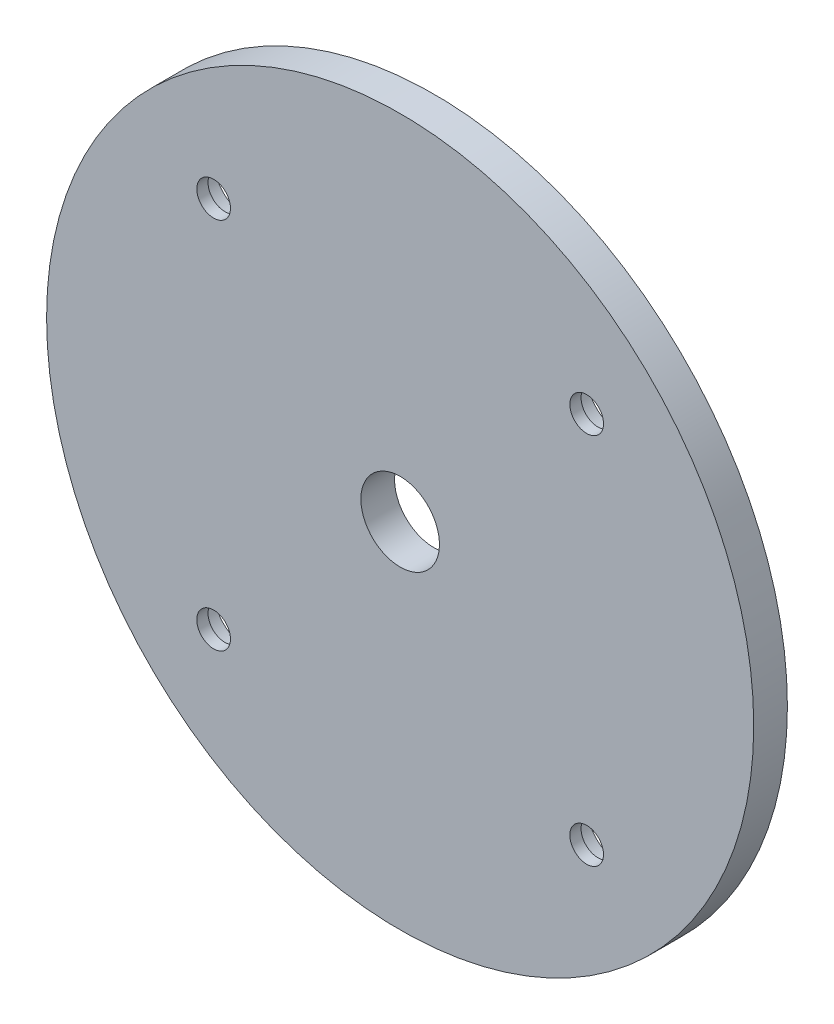
ISO-10303-21;
HEADER;
FILE_DESCRIPTION(('STEP AP214'),'2;1');
FILE_NAME('part.step','',(''),(''),'','','');
FILE_SCHEMA(('AUTOMOTIVE_DESIGN { 1 0 10303 214 1 1 1 1 }'));
ENDSEC;
DATA;
#1=APPLICATION_CONTEXT('core data for automotive mechanical design processes');
#2=APPLICATION_PROTOCOL_DEFINITION('international standard','automotive_design',2000,#1);
#3=PRODUCT_CONTEXT('',#1,'mechanical');
#4=PRODUCT('Part','Part','',(#3));
#5=PRODUCT_RELATED_PRODUCT_CATEGORY('part','',(#4));
#6=PRODUCT_DEFINITION_FORMATION('','',#4);
#7=PRODUCT_DEFINITION_CONTEXT('part definition',#1,'design');
#8=PRODUCT_DEFINITION('design','',#6,#7);
#9=PRODUCT_DEFINITION_SHAPE('','',#8);
#10=(LENGTH_UNIT() NAMED_UNIT(*) SI_UNIT(.MILLI.,.METRE.));
#11=(NAMED_UNIT(*) PLANE_ANGLE_UNIT() SI_UNIT($,.RADIAN.));
#12=(NAMED_UNIT(*) SI_UNIT($,.STERADIAN.) SOLID_ANGLE_UNIT());
#13=UNCERTAINTY_MEASURE_WITH_UNIT(LENGTH_MEASURE(1.E-05),#10,'distance_accuracy_value','');
#14=(GEOMETRIC_REPRESENTATION_CONTEXT(3) GLOBAL_UNCERTAINTY_ASSIGNED_CONTEXT((#13)) GLOBAL_UNIT_ASSIGNED_CONTEXT((#10,
#11,#12)) REPRESENTATION_CONTEXT('',''));
#15=CARTESIAN_POINT('',(0.,0.,0.));
#16=DIRECTION('',(0.,0.,1.));
#17=DIRECTION('',(1.,0.,0.));
#18=AXIS2_PLACEMENT_3D('',#15,#16,#17);
#19=CARTESIAN_POINT('',(-60.0662024055146,24.8241196667046,3.));
#20=DIRECTION('',(0.,0.,-1.));
#21=DIRECTION('',(-1.,0.,0.));
#22=AXIS2_PLACEMENT_3D('',#19,#20,#21);
#23=CYLINDRICAL_SURFACE('',#22,1.5);
#24=CARTESIAN_POINT('',(-60.0662024055146,24.8241196667046,3.));
#25=DIRECTION('',(0.,0.,1.));
#26=DIRECTION('',(1.,0.,0.));
#27=AXIS2_PLACEMENT_3D('',#24,#25,#26);
#28=CIRCLE('',#27,1.5);
#29=CARTESIAN_POINT('',(-58.5662024055146,24.8241196667046,3.));
#30=VERTEX_POINT('',#29);
#31=EDGE_CURVE('E186',#30,#30,#28,.T.);
#32=ORIENTED_EDGE('',*,*,#31,.T.);
#33=EDGE_LOOP('',(#32));
#34=FACE_BOUND('',#33,.T.);
#35=CARTESIAN_POINT('',(-60.0662024055146,24.8241196667046,2.));
#36=DIRECTION('',(0.,0.,-1.));
#37=DIRECTION('',(-1.,0.,0.));
#38=AXIS2_PLACEMENT_3D('',#35,#36,#37);
#39=CIRCLE('',#38,1.5);
#40=CARTESIAN_POINT('',(-61.5662024055146,24.8241196667046,2.));
#41=VERTEX_POINT('',#40);
#42=EDGE_CURVE('E37',#41,#41,#39,.T.);
#43=ORIENTED_EDGE('',*,*,#42,.T.);
#44=EDGE_LOOP('',(#43));
#45=FACE_BOUND('',#44,.T.);
#46=ADVANCED_FACE('F33',(#34,#45),#23,.F.);
#47=CARTESIAN_POINT('',(-26.8321836897469,24.8241196667046,3.));
#48=DIRECTION('',(0.,0.,-1.));
#49=DIRECTION('',(-1.,0.,0.));
#50=AXIS2_PLACEMENT_3D('',#47,#48,#49);
#51=CYLINDRICAL_SURFACE('',#50,1.5);
#52=CARTESIAN_POINT('',(-26.8321836897469,24.8241196667046,3.));
#53=DIRECTION('',(0.,0.,1.));
#54=DIRECTION('',(1.,0.,0.));
#55=AXIS2_PLACEMENT_3D('',#52,#53,#54);
#56=CIRCLE('',#55,1.5);
#57=CARTESIAN_POINT('',(-25.3321836897469,24.8241196667046,3.));
#58=VERTEX_POINT('',#57);
#59=EDGE_CURVE('E183',#58,#58,#56,.T.);
#60=ORIENTED_EDGE('',*,*,#59,.T.);
#61=EDGE_LOOP('',(#60));
#62=FACE_BOUND('',#61,.T.);
#63=CARTESIAN_POINT('',(-26.8321836897469,24.8241196667046,2.));
#64=DIRECTION('',(0.,0.,-1.));
#65=DIRECTION('',(-1.,0.,0.));
#66=AXIS2_PLACEMENT_3D('',#63,#64,#65);
#67=CIRCLE('',#66,1.5);
#68=CARTESIAN_POINT('',(-28.3321836897469,24.8241196667046,2.));
#69=VERTEX_POINT('',#68);
#70=EDGE_CURVE('E197',#69,#69,#67,.T.);
#71=ORIENTED_EDGE('',*,*,#70,.T.);
#72=EDGE_LOOP('',(#71));
#73=FACE_BOUND('',#72,.T.);
#74=ADVANCED_FACE('F266',(#62,#73),#51,.F.);
#75=CARTESIAN_POINT('',(-26.8321836897469,-8.40989904906317,3.));
#76=DIRECTION('',(0.,0.,-1.));
#77=DIRECTION('',(-1.,0.,0.));
#78=AXIS2_PLACEMENT_3D('',#75,#76,#77);
#79=CYLINDRICAL_SURFACE('',#78,1.5);
#80=CARTESIAN_POINT('',(-26.8321836897469,-8.40989904906317,3.));
#81=DIRECTION('',(0.,0.,1.));
#82=DIRECTION('',(1.,0.,0.));
#83=AXIS2_PLACEMENT_3D('',#80,#81,#82);
#84=CIRCLE('',#83,1.5);
#85=CARTESIAN_POINT('',(-25.3321836897469,-8.40989904906317,3.));
#86=VERTEX_POINT('',#85);
#87=EDGE_CURVE('E180',#86,#86,#84,.T.);
#88=ORIENTED_EDGE('',*,*,#87,.T.);
#89=EDGE_LOOP('',(#88));
#90=FACE_BOUND('',#89,.T.);
#91=CARTESIAN_POINT('',(-26.8321836897469,-8.40989904906317,2.));
#92=DIRECTION('',(0.,0.,-1.));
#93=DIRECTION('',(-1.,0.,0.));
#94=AXIS2_PLACEMENT_3D('',#91,#92,#93);
#95=CIRCLE('',#94,1.5);
#96=CARTESIAN_POINT('',(-28.3321836897469,-8.40989904906317,2.));
#97=VERTEX_POINT('',#96);
#98=EDGE_CURVE('E194',#97,#97,#95,.T.);
#99=ORIENTED_EDGE('',*,*,#98,.T.);
#100=EDGE_LOOP('',(#99));
#101=FACE_BOUND('',#100,.T.);
#102=ADVANCED_FACE('F272',(#90,#101),#79,.F.);
#103=CARTESIAN_POINT('',(-60.0662024055146,-8.40989904906316,3.));
#104=DIRECTION('',(0.,0.,-1.));
#105=DIRECTION('',(-1.,0.,0.));
#106=AXIS2_PLACEMENT_3D('',#103,#104,#105);
#107=CYLINDRICAL_SURFACE('',#106,1.5);
#108=CARTESIAN_POINT('',(-60.0662024055146,-8.40989904906316,3.));
#109=DIRECTION('',(0.,0.,1.));
#110=DIRECTION('',(1.,0.,0.));
#111=AXIS2_PLACEMENT_3D('',#108,#109,#110);
#112=CIRCLE('',#111,1.5);
#113=CARTESIAN_POINT('',(-58.5662024055146,-8.40989904906316,3.));
#114=VERTEX_POINT('',#113);
#115=EDGE_CURVE('E175',#114,#114,#112,.T.);
#116=ORIENTED_EDGE('',*,*,#115,.T.);
#117=EDGE_LOOP('',(#116));
#118=FACE_BOUND('',#117,.T.);
#119=CARTESIAN_POINT('',(-60.0662024055146,-8.40989904906316,2.));
#120=DIRECTION('',(0.,0.,-1.));
#121=DIRECTION('',(-1.,0.,0.));
#122=AXIS2_PLACEMENT_3D('',#119,#120,#121);
#123=CIRCLE('',#122,1.5);
#124=CARTESIAN_POINT('',(-61.5662024055146,-8.40989904906316,2.));
#125=VERTEX_POINT('',#124);
#126=EDGE_CURVE('E191',#125,#125,#123,.T.);
#127=ORIENTED_EDGE('',*,*,#126,.T.);
#128=EDGE_LOOP('',(#127));
#129=FACE_BOUND('',#128,.T.);
#130=ADVANCED_FACE('F278',(#118,#129),#107,.F.);
#131=CARTESIAN_POINT('',(-43.4491930476308,8.20711030882074,3.));
#132=DIRECTION('',(0.,0.,1.));
#133=DIRECTION('',(1.,0.,0.));
#134=AXIS2_PLACEMENT_3D('',#131,#132,#133);
#135=PLANE('',#134);
#136=CARTESIAN_POINT('',(-43.4491930476308,8.20711030882074,3.));
#137=DIRECTION('',(0.,0.,-1.));
#138=DIRECTION('',(-1.,0.,0.));
#139=AXIS2_PLACEMENT_3D('',#136,#137,#138);
#140=CIRCLE('',#139,3.5);
#141=CARTESIAN_POINT('',(-46.9491930476308,8.20711030882074,3.));
#142=VERTEX_POINT('',#141);
#143=EDGE_CURVE('E172',#142,#142,#140,.T.);
#144=ORIENTED_EDGE('',*,*,#143,.T.);
#145=EDGE_LOOP('',(#144));
#146=FACE_BOUND('',#145,.T.);
#147=ORIENTED_EDGE('',*,*,#87,.F.);
#148=EDGE_LOOP('',(#147));
#149=FACE_BOUND('',#148,.T.);
#150=ORIENTED_EDGE('',*,*,#31,.F.);
#151=EDGE_LOOP('',(#150));
#152=FACE_BOUND('',#151,.T.);
#153=CARTESIAN_POINT('',(-43.4491930476308,8.20711030882074,3.));
#154=DIRECTION('',(0.,0.,1.));
#155=DIRECTION('',(1.,0.,0.));
#156=AXIS2_PLACEMENT_3D('',#153,#154,#155);
#157=CIRCLE('',#156,31.5);
#158=CARTESIAN_POINT('',(-11.9491930476308,8.20711030882074,3.));
#159=VERTEX_POINT('',#158);
#160=EDGE_CURVE('E11',#159,#159,#157,.T.);
#161=ORIENTED_EDGE('',*,*,#160,.T.);
#162=EDGE_LOOP('',(#161));
#163=FACE_BOUND('',#162,.T.);
#164=ORIENTED_EDGE('',*,*,#59,.F.);
#165=EDGE_LOOP('',(#164));
#166=FACE_BOUND('',#165,.T.);
#167=ORIENTED_EDGE('',*,*,#115,.F.);
#168=EDGE_LOOP('',(#167));
#169=FACE_BOUND('',#168,.T.);
#170=ADVANCED_FACE('F244',(#146,#149,#152,#163,#166,#169),#135,.T.);
#171=CARTESIAN_POINT('',(-43.4491930476308,8.20711030882074,0.));
#172=DIRECTION('',(0.,0.,1.));
#173=DIRECTION('',(1.,0.,0.));
#174=AXIS2_PLACEMENT_3D('',#171,#172,#173);
#175=PLANE('',#174);
#176=CARTESIAN_POINT('',(-60.0662024055146,24.8241196667046,0.));
#177=DIRECTION('',(0.,0.,-1.));
#178=DIRECTION('',(-1.,0.,0.));
#179=AXIS2_PLACEMENT_3D('',#176,#177,#178);
#180=CIRCLE('',#179,3.);
#181=CARTESIAN_POINT('',(-63.0662024055146,24.8241196667046,0.));
#182=VERTEX_POINT('',#181);
#183=EDGE_CURVE('E214',#182,#182,#180,.T.);
#184=ORIENTED_EDGE('',*,*,#183,.F.);
#185=EDGE_LOOP('',(#184));
#186=FACE_BOUND('',#185,.T.);
#187=CARTESIAN_POINT('',(-26.8321836897469,-8.40989904906317,0.));
#188=DIRECTION('',(0.,0.,-1.));
#189=DIRECTION('',(-1.,0.,0.));
#190=AXIS2_PLACEMENT_3D('',#187,#188,#189);
#191=CIRCLE('',#190,3.);
#192=CARTESIAN_POINT('',(-29.8321836897469,-8.40989904906317,0.));
#193=VERTEX_POINT('',#192);
#194=EDGE_CURVE('E226',#193,#193,#191,.T.);
#195=ORIENTED_EDGE('',*,*,#194,.F.);
#196=EDGE_LOOP('',(#195));
#197=FACE_BOUND('',#196,.T.);
#198=CARTESIAN_POINT('',(-60.0662024055146,-8.40989904906316,0.));
#199=DIRECTION('',(0.,0.,-1.));
#200=DIRECTION('',(-1.,0.,0.));
#201=AXIS2_PLACEMENT_3D('',#198,#199,#200);
#202=CIRCLE('',#201,3.00000000000001);
#203=CARTESIAN_POINT('',(-63.0662024055146,-8.40989904906316,0.));
#204=VERTEX_POINT('',#203);
#205=EDGE_CURVE('E221',#204,#204,#202,.T.);
#206=ORIENTED_EDGE('',*,*,#205,.F.);
#207=EDGE_LOOP('',(#206));
#208=FACE_BOUND('',#207,.T.);
#209=CARTESIAN_POINT('',(-26.8321836897469,24.8241196667046,0.));
#210=DIRECTION('',(0.,0.,-1.));
#211=DIRECTION('',(-1.,0.,0.));
#212=AXIS2_PLACEMENT_3D('',#209,#210,#211);
#213=CIRCLE('',#212,3.);
#214=CARTESIAN_POINT('',(-29.8321836897469,24.8241196667046,0.));
#215=VERTEX_POINT('',#214);
#216=EDGE_CURVE('E126',#215,#215,#213,.T.);
#217=ORIENTED_EDGE('',*,*,#216,.F.);
#218=EDGE_LOOP('',(#217));
#219=FACE_BOUND('',#218,.T.);
#220=DIRECTION('',(1.,0.,0.));
#221=VECTOR('',#220,1.);
#222=CARTESIAN_POINT('',(-72.4491930476308,7.20711030882078,0.));
#223=LINE('',#222,#221);
#224=CARTESIAN_POINT('',(-72.4491930476308,7.20711030882078,0.));
#225=VERTEX_POINT('',#224);
#226=CARTESIAN_POINT('',(-69.4491930476308,7.20711030882077,0.));
#227=VERTEX_POINT('',#226);
#228=EDGE_CURVE('E132',#225,#227,#223,.T.);
#229=ORIENTED_EDGE('',*,*,#228,.F.);
#230=CARTESIAN_POINT('',(-43.4491930476308,7.20711030882077,0.));
#231=DIRECTION('',(0.,0.,-1.));
#232=DIRECTION('',(-1.,0.,0.));
#233=AXIS2_PLACEMENT_3D('',#230,#231,#232);
#234=CIRCLE('',#233,29.);
#235=CARTESIAN_POINT('',(-14.4491930476308,7.20711030882077,0.));
#236=VERTEX_POINT('',#235);
#237=EDGE_CURVE('E50',#236,#225,#234,.T.);
#238=ORIENTED_EDGE('',*,*,#237,.F.);
#239=DIRECTION('',(1.,0.,0.));
#240=VECTOR('',#239,1.);
#241=CARTESIAN_POINT('',(-14.4491930476308,7.20711030882077,0.));
#242=LINE('',#241,#240);
#243=CARTESIAN_POINT('',(-17.4491930476308,7.20711030882077,0.));
#244=VERTEX_POINT('',#243);
#245=EDGE_CURVE('E120',#244,#236,#242,.T.);
#246=ORIENTED_EDGE('',*,*,#245,.F.);
#247=CARTESIAN_POINT('',(-43.4491930476308,7.20711030882077,0.));
#248=DIRECTION('',(0.,0.,1.));
#249=DIRECTION('',(-1.,0.,0.));
#250=AXIS2_PLACEMENT_3D('',#247,#248,#249);
#251=CIRCLE('',#250,26.);
#252=EDGE_CURVE('E123',#227,#244,#251,.T.);
#253=ORIENTED_EDGE('',*,*,#252,.F.);
#254=EDGE_LOOP('',(#229,#238,#246,#253));
#255=FACE_BOUND('',#254,.T.);
#256=DIRECTION('',(-1.,0.,0.));
#257=VECTOR('',#256,1.);
#258=CARTESIAN_POINT('',(-14.4491930476308,9.20711030882073,0.));
#259=LINE('',#258,#257);
#260=CARTESIAN_POINT('',(-14.4491930476308,9.20711030882073,0.));
#261=VERTEX_POINT('',#260);
#262=CARTESIAN_POINT('',(-17.4491930476308,9.20711030882072,0.));
#263=VERTEX_POINT('',#262);
#264=EDGE_CURVE('E158',#261,#263,#259,.T.);
#265=ORIENTED_EDGE('',*,*,#264,.F.);
#266=CARTESIAN_POINT('',(-43.4491930476308,9.20711030882073,0.));
#267=DIRECTION('',(0.,0.,-1.));
#268=DIRECTION('',(1.,0.,0.));
#269=AXIS2_PLACEMENT_3D('',#266,#267,#268);
#270=CIRCLE('',#269,29.);
#271=CARTESIAN_POINT('',(-72.4491930476308,9.20711030882073,0.));
#272=VERTEX_POINT('',#271);
#273=EDGE_CURVE('E58',#272,#261,#270,.T.);
#274=ORIENTED_EDGE('',*,*,#273,.F.);
#275=DIRECTION('',(-1.,0.,0.));
#276=VECTOR('',#275,1.);
#277=CARTESIAN_POINT('',(-72.4491930476308,9.20711030882073,0.));
#278=LINE('',#277,#276);
#279=CARTESIAN_POINT('',(-69.4491930476308,9.20711030882072,0.));
#280=VERTEX_POINT('',#279);
#281=EDGE_CURVE('E147',#280,#272,#278,.T.);
#282=ORIENTED_EDGE('',*,*,#281,.F.);
#283=CARTESIAN_POINT('',(-43.4491930476308,9.2071103088207,0.));
#284=DIRECTION('',(0.,0.,1.));
#285=DIRECTION('',(1.,0.,0.));
#286=AXIS2_PLACEMENT_3D('',#283,#284,#285);
#287=CIRCLE('',#286,26.);
#288=EDGE_CURVE('E161',#263,#280,#287,.T.);
#289=ORIENTED_EDGE('',*,*,#288,.F.);
#290=EDGE_LOOP('',(#265,#274,#282,#289));
#291=FACE_BOUND('',#290,.T.);
#292=CARTESIAN_POINT('',(-43.4491930476308,8.20711030882074,0.));
#293=DIRECTION('',(0.,0.,-1.));
#294=DIRECTION('',(-1.,0.,0.));
#295=AXIS2_PLACEMENT_3D('',#292,#293,#294);
#296=CIRCLE('',#295,3.5);
#297=CARTESIAN_POINT('',(-46.9491930476308,8.20711030882074,0.));
#298=VERTEX_POINT('',#297);
#299=EDGE_CURVE('E139',#298,#298,#296,.T.);
#300=ORIENTED_EDGE('',*,*,#299,.F.);
#301=EDGE_LOOP('',(#300));
#302=FACE_BOUND('',#301,.T.);
#303=CARTESIAN_POINT('',(-43.4491930476308,8.20711030882074,0.));
#304=DIRECTION('',(0.,0.,1.));
#305=DIRECTION('',(1.,0.,0.));
#306=AXIS2_PLACEMENT_3D('',#303,#304,#305);
#307=CIRCLE('',#306,31.5);
#308=CARTESIAN_POINT('',(-11.9491930476308,8.20711030882074,0.));
#309=VERTEX_POINT('',#308);
#310=EDGE_CURVE('E42',#309,#309,#307,.T.);
#311=ORIENTED_EDGE('',*,*,#310,.F.);
#312=EDGE_LOOP('',(#311));
#313=FACE_BOUND('',#312,.T.);
#314=ADVANCED_FACE('F241',(#186,#197,#208,#219,#255,#291,#302,#313),#175,.F.);
#315=CARTESIAN_POINT('',(-43.4491930476308,8.20711030882074,3.));
#316=DIRECTION('',(0.,0.,-1.));
#317=DIRECTION('',(-1.,0.,0.));
#318=AXIS2_PLACEMENT_3D('',#315,#316,#317);
#319=CYLINDRICAL_SURFACE('',#318,31.5);
#320=ORIENTED_EDGE('',*,*,#160,.F.);
#321=EDGE_LOOP('',(#320));
#322=FACE_BOUND('',#321,.T.);
#323=ORIENTED_EDGE('',*,*,#310,.T.);
#324=EDGE_LOOP('',(#323));
#325=FACE_BOUND('',#324,.T.);
#326=ADVANCED_FACE('F35',(#322,#325),#319,.T.);
#327=CARTESIAN_POINT('',(-43.4491930476308,8.20711030882074,3.));
#328=DIRECTION('',(0.,0.,-1.));
#329=DIRECTION('',(-1.,0.,0.));
#330=AXIS2_PLACEMENT_3D('',#327,#328,#329);
#331=CYLINDRICAL_SURFACE('',#330,3.5);
#332=ORIENTED_EDGE('',*,*,#143,.F.);
#333=EDGE_LOOP('',(#332));
#334=FACE_BOUND('',#333,.T.);
#335=ORIENTED_EDGE('',*,*,#299,.T.);
#336=EDGE_LOOP('',(#335));
#337=FACE_BOUND('',#336,.T.);
#338=ADVANCED_FACE('F256',(#334,#337),#331,.F.);
#339=CARTESIAN_POINT('',(-43.4491930476308,9.20711030882073,1.));
#340=DIRECTION('',(0.,0.,-1.));
#341=DIRECTION('',(-1.,0.,0.));
#342=AXIS2_PLACEMENT_3D('',#339,#340,#341);
#343=CYLINDRICAL_SURFACE('',#342,29.);
#344=ORIENTED_EDGE('',*,*,#273,.T.);
#345=DIRECTION('',(0.,0.,-1.));
#346=VECTOR('',#345,1.);
#347=CARTESIAN_POINT('',(-14.4491930476308,9.20711030882073,1.));
#348=LINE('',#347,#346);
#349=CARTESIAN_POINT('',(-14.4491930476308,9.20711030882073,1.));
#350=VERTEX_POINT('',#349);
#351=EDGE_CURVE('E156',#350,#261,#348,.T.);
#352=ORIENTED_EDGE('',*,*,#351,.F.);
#353=CARTESIAN_POINT('',(-43.4491930476308,9.20711030882073,1.));
#354=DIRECTION('',(0.,0.,-1.));
#355=DIRECTION('',(1.,0.,0.));
#356=AXIS2_PLACEMENT_3D('',#353,#354,#355);
#357=CIRCLE('',#356,29.);
#358=CARTESIAN_POINT('',(-72.4491930476308,9.20711030882073,1.));
#359=VERTEX_POINT('',#358);
#360=EDGE_CURVE('E143',#359,#350,#357,.T.);
#361=ORIENTED_EDGE('',*,*,#360,.F.);
#362=DIRECTION('',(0.,0.,-1.));
#363=VECTOR('',#362,1.);
#364=CARTESIAN_POINT('',(-72.4491930476308,9.20711030882073,1.));
#365=LINE('',#364,#363);
#366=EDGE_CURVE('E133',#359,#272,#365,.T.);
#367=ORIENTED_EDGE('',*,*,#366,.T.);
#368=EDGE_LOOP('',(#344,#352,#361,#367));
#369=FACE_BOUND('',#368,.T.);
#370=ADVANCED_FACE('F261',(#369),#343,.F.);
#371=CARTESIAN_POINT('',(-72.4491930476308,9.20711030882073,1.));
#372=DIRECTION('',(0.,-1.,0.));
#373=DIRECTION('',(1.,0.,0.));
#374=AXIS2_PLACEMENT_3D('',#371,#372,#373);
#375=PLANE('',#374);
#376=ORIENTED_EDGE('',*,*,#281,.T.);
#377=ORIENTED_EDGE('',*,*,#366,.F.);
#378=DIRECTION('',(-1.,0.,0.));
#379=VECTOR('',#378,1.);
#380=CARTESIAN_POINT('',(-72.4491930476308,9.20711030882073,1.));
#381=LINE('',#380,#379);
#382=CARTESIAN_POINT('',(-69.4491930476308,9.20711030882072,1.));
#383=VERTEX_POINT('',#382);
#384=EDGE_CURVE('E153',#383,#359,#381,.T.);
#385=ORIENTED_EDGE('',*,*,#384,.F.);
#386=DIRECTION('',(0.,0.,-1.));
#387=VECTOR('',#386,1.);
#388=CARTESIAN_POINT('',(-69.4491930476308,9.20711030882072,1.));
#389=LINE('',#388,#387);
#390=EDGE_CURVE('E167',#383,#280,#389,.T.);
#391=ORIENTED_EDGE('',*,*,#390,.T.);
#392=EDGE_LOOP('',(#376,#377,#385,#391));
#393=FACE_BOUND('',#392,.T.);
#394=ADVANCED_FACE('F346',(#393),#375,.F.);
#395=CARTESIAN_POINT('',(-43.4491930476308,9.2071103088207,1.));
#396=DIRECTION('',(0.,0.,-1.));
#397=DIRECTION('',(-1.,0.,0.));
#398=AXIS2_PLACEMENT_3D('',#395,#396,#397);
#399=CYLINDRICAL_SURFACE('',#398,26.);
#400=ORIENTED_EDGE('',*,*,#288,.T.);
#401=ORIENTED_EDGE('',*,*,#390,.F.);
#402=CARTESIAN_POINT('',(-43.4491930476308,9.2071103088207,1.));
#403=DIRECTION('',(0.,0.,1.));
#404=DIRECTION('',(1.,0.,0.));
#405=AXIS2_PLACEMENT_3D('',#402,#403,#404);
#406=CIRCLE('',#405,26.);
#407=CARTESIAN_POINT('',(-17.4491930476308,9.20711030882072,1.));
#408=VERTEX_POINT('',#407);
#409=EDGE_CURVE('E150',#408,#383,#406,.T.);
#410=ORIENTED_EDGE('',*,*,#409,.F.);
#411=DIRECTION('',(0.,0.,-1.));
#412=VECTOR('',#411,1.);
#413=CARTESIAN_POINT('',(-17.4491930476308,9.20711030882072,1.));
#414=LINE('',#413,#412);
#415=EDGE_CURVE('E169',#408,#263,#414,.T.);
#416=ORIENTED_EDGE('',*,*,#415,.T.);
#417=EDGE_LOOP('',(#400,#401,#410,#416));
#418=FACE_BOUND('',#417,.T.);
#419=ADVANCED_FACE('F349',(#418),#399,.T.);
#420=CARTESIAN_POINT('',(-14.4491930476308,9.20711030882073,1.));
#421=DIRECTION('',(0.,-1.,0.));
#422=DIRECTION('',(1.,0.,0.));
#423=AXIS2_PLACEMENT_3D('',#420,#421,#422);
#424=PLANE('',#423);
#425=ORIENTED_EDGE('',*,*,#264,.T.);
#426=ORIENTED_EDGE('',*,*,#415,.F.);
#427=DIRECTION('',(-1.,0.,0.));
#428=VECTOR('',#427,1.);
#429=CARTESIAN_POINT('',(-14.4491930476308,9.20711030882073,1.));
#430=LINE('',#429,#428);
#431=EDGE_CURVE('E146',#350,#408,#430,.T.);
#432=ORIENTED_EDGE('',*,*,#431,.F.);
#433=ORIENTED_EDGE('',*,*,#351,.T.);
#434=EDGE_LOOP('',(#425,#426,#432,#433));
#435=FACE_BOUND('',#434,.T.);
#436=ADVANCED_FACE('F344',(#435),#424,.F.);
#437=CARTESIAN_POINT('',(-43.4491930476308,9.20711030882073,1.));
#438=DIRECTION('',(0.,0.,1.));
#439=DIRECTION('',(1.,0.,0.));
#440=AXIS2_PLACEMENT_3D('',#437,#438,#439);
#441=PLANE('',#440);
#442=ORIENTED_EDGE('',*,*,#360,.T.);
#443=ORIENTED_EDGE('',*,*,#431,.T.);
#444=ORIENTED_EDGE('',*,*,#409,.T.);
#445=ORIENTED_EDGE('',*,*,#384,.T.);
#446=EDGE_LOOP('',(#442,#443,#444,#445));
#447=FACE_BOUND('',#446,.T.);
#448=ADVANCED_FACE('F341',(#447),#441,.F.);
#449=CARTESIAN_POINT('',(-43.4491930476308,7.20711030882077,1.));
#450=DIRECTION('',(0.,0.,-1.));
#451=DIRECTION('',(-1.,0.,0.));
#452=AXIS2_PLACEMENT_3D('',#449,#450,#451);
#453=CYLINDRICAL_SURFACE('',#452,29.);
#454=ORIENTED_EDGE('',*,*,#237,.T.);
#455=DIRECTION('',(0.,0.,-1.));
#456=VECTOR('',#455,1.);
#457=CARTESIAN_POINT('',(-72.4491930476308,7.20711030882078,1.));
#458=LINE('',#457,#456);
#459=CARTESIAN_POINT('',(-72.4491930476308,7.20711030882078,1.));
#460=VERTEX_POINT('',#459);
#461=EDGE_CURVE('E98',#460,#225,#458,.T.);
#462=ORIENTED_EDGE('',*,*,#461,.F.);
#463=CARTESIAN_POINT('',(-43.4491930476308,7.20711030882077,1.));
#464=DIRECTION('',(0.,0.,-1.));
#465=DIRECTION('',(-1.,0.,0.));
#466=AXIS2_PLACEMENT_3D('',#463,#464,#465);
#467=CIRCLE('',#466,29.);
#468=CARTESIAN_POINT('',(-14.4491930476308,7.20711030882077,1.));
#469=VERTEX_POINT('',#468);
#470=EDGE_CURVE('E102',#469,#460,#467,.T.);
#471=ORIENTED_EDGE('',*,*,#470,.F.);
#472=DIRECTION('',(0.,0.,-1.));
#473=VECTOR('',#472,1.);
#474=CARTESIAN_POINT('',(-14.4491930476308,7.20711030882077,1.));
#475=LINE('',#474,#473);
#476=EDGE_CURVE('E137',#469,#236,#475,.T.);
#477=ORIENTED_EDGE('',*,*,#476,.T.);
#478=EDGE_LOOP('',(#454,#462,#471,#477));
#479=FACE_BOUND('',#478,.T.);
#480=ADVANCED_FACE('F100',(#479),#453,.F.);
#481=CARTESIAN_POINT('',(-14.4491930476308,7.20711030882077,1.));
#482=DIRECTION('',(0.,1.,0.));
#483=DIRECTION('',(-1.,0.,0.));
#484=AXIS2_PLACEMENT_3D('',#481,#482,#483);
#485=PLANE('',#484);
#486=ORIENTED_EDGE('',*,*,#245,.T.);
#487=ORIENTED_EDGE('',*,*,#476,.F.);
#488=DIRECTION('',(1.,0.,0.));
#489=VECTOR('',#488,1.);
#490=CARTESIAN_POINT('',(-14.4491930476308,7.20711030882077,1.));
#491=LINE('',#490,#489);
#492=CARTESIAN_POINT('',(-17.4491930476308,7.20711030882077,1.));
#493=VERTEX_POINT('',#492);
#494=EDGE_CURVE('E108',#493,#469,#491,.T.);
#495=ORIENTED_EDGE('',*,*,#494,.F.);
#496=DIRECTION('',(0.,0.,-1.));
#497=VECTOR('',#496,1.);
#498=CARTESIAN_POINT('',(-17.4491930476308,7.20711030882077,1.));
#499=LINE('',#498,#497);
#500=EDGE_CURVE('E140',#493,#244,#499,.T.);
#501=ORIENTED_EDGE('',*,*,#500,.T.);
#502=EDGE_LOOP('',(#486,#487,#495,#501));
#503=FACE_BOUND('',#502,.T.);
#504=ADVANCED_FACE('F329',(#503),#485,.F.);
#505=CARTESIAN_POINT('',(-43.4491930476308,7.20711030882077,1.));
#506=DIRECTION('',(0.,0.,-1.));
#507=DIRECTION('',(-1.,0.,0.));
#508=AXIS2_PLACEMENT_3D('',#505,#506,#507);
#509=CYLINDRICAL_SURFACE('',#508,26.);
#510=ORIENTED_EDGE('',*,*,#252,.T.);
#511=ORIENTED_EDGE('',*,*,#500,.F.);
#512=CARTESIAN_POINT('',(-43.4491930476308,7.20711030882077,1.));
#513=DIRECTION('',(0.,0.,1.));
#514=DIRECTION('',(-1.,0.,0.));
#515=AXIS2_PLACEMENT_3D('',#512,#513,#514);
#516=CIRCLE('',#515,26.);
#517=CARTESIAN_POINT('',(-69.4491930476308,7.20711030882077,1.));
#518=VERTEX_POINT('',#517);
#519=EDGE_CURVE('E116',#518,#493,#516,.T.);
#520=ORIENTED_EDGE('',*,*,#519,.F.);
#521=DIRECTION('',(0.,0.,-1.));
#522=VECTOR('',#521,1.);
#523=CARTESIAN_POINT('',(-69.4491930476308,7.20711030882077,1.));
#524=LINE('',#523,#522);
#525=EDGE_CURVE('E107',#518,#227,#524,.T.);
#526=ORIENTED_EDGE('',*,*,#525,.T.);
#527=EDGE_LOOP('',(#510,#511,#520,#526));
#528=FACE_BOUND('',#527,.T.);
#529=ADVANCED_FACE('F332',(#528),#509,.T.);
#530=CARTESIAN_POINT('',(-72.4491930476308,7.20711030882078,1.));
#531=DIRECTION('',(0.,1.,0.));
#532=DIRECTION('',(-1.,0.,0.));
#533=AXIS2_PLACEMENT_3D('',#530,#531,#532);
#534=PLANE('',#533);
#535=ORIENTED_EDGE('',*,*,#228,.T.);
#536=ORIENTED_EDGE('',*,*,#525,.F.);
#537=DIRECTION('',(1.,0.,0.));
#538=VECTOR('',#537,1.);
#539=CARTESIAN_POINT('',(-72.4491930476308,7.20711030882078,1.));
#540=LINE('',#539,#538);
#541=EDGE_CURVE('E111',#460,#518,#540,.T.);
#542=ORIENTED_EDGE('',*,*,#541,.F.);
#543=ORIENTED_EDGE('',*,*,#461,.T.);
#544=EDGE_LOOP('',(#535,#536,#542,#543));
#545=FACE_BOUND('',#544,.T.);
#546=ADVANCED_FACE('F112',(#545),#534,.F.);
#547=CARTESIAN_POINT('',(-43.4491930476308,7.20711030882077,1.));
#548=DIRECTION('',(0.,0.,-1.));
#549=DIRECTION('',(-1.,0.,0.));
#550=AXIS2_PLACEMENT_3D('',#547,#548,#549);
#551=PLANE('',#550);
#552=ORIENTED_EDGE('',*,*,#470,.T.);
#553=ORIENTED_EDGE('',*,*,#541,.T.);
#554=ORIENTED_EDGE('',*,*,#519,.T.);
#555=ORIENTED_EDGE('',*,*,#494,.T.);
#556=EDGE_LOOP('',(#552,#553,#554,#555));
#557=FACE_BOUND('',#556,.T.);
#558=ADVANCED_FACE('F118',(#557),#551,.T.);
#559=CARTESIAN_POINT('',(-60.0662024055146,-8.40989904906316,2.));
#560=DIRECTION('',(0.,0.,-1.));
#561=DIRECTION('',(-1.,0.,0.));
#562=AXIS2_PLACEMENT_3D('',#559,#560,#561);
#563=CYLINDRICAL_SURFACE('',#562,3.00000000000001);
#564=CARTESIAN_POINT('',(-60.0662024055146,-8.40989904906316,2.));
#565=DIRECTION('',(0.,0.,-1.));
#566=DIRECTION('',(-1.,0.,0.));
#567=AXIS2_PLACEMENT_3D('',#564,#565,#566);
#568=CIRCLE('',#567,3.00000000000001);
#569=CARTESIAN_POINT('',(-63.0662024055146,-8.40989904906316,2.));
#570=VERTEX_POINT('',#569);
#571=EDGE_CURVE('E228',#570,#570,#568,.T.);
#572=ORIENTED_EDGE('',*,*,#571,.F.);
#573=EDGE_LOOP('',(#572));
#574=FACE_BOUND('',#573,.T.);
#575=ORIENTED_EDGE('',*,*,#205,.T.);
#576=EDGE_LOOP('',(#575));
#577=FACE_BOUND('',#576,.T.);
#578=ADVANCED_FACE('F302',(#574,#577),#563,.F.);
#579=CARTESIAN_POINT('',(-60.0662024055146,-8.40989904906316,2.));
#580=DIRECTION('',(0.,0.,-1.));
#581=DIRECTION('',(-1.,0.,0.));
#582=AXIS2_PLACEMENT_3D('',#579,#580,#581);
#583=PLANE('',#582);
#584=ORIENTED_EDGE('',*,*,#126,.F.);
#585=EDGE_LOOP('',(#584));
#586=FACE_BOUND('',#585,.T.);
#587=ORIENTED_EDGE('',*,*,#571,.T.);
#588=EDGE_LOOP('',(#587));
#589=FACE_BOUND('',#588,.T.);
#590=ADVANCED_FACE('F298',(#586,#589),#583,.T.);
#591=CARTESIAN_POINT('',(-26.8321836897469,-8.40989904906317,2.));
#592=DIRECTION('',(0.,0.,-1.));
#593=DIRECTION('',(-1.,0.,0.));
#594=AXIS2_PLACEMENT_3D('',#591,#592,#593);
#595=CYLINDRICAL_SURFACE('',#594,3.);
#596=CARTESIAN_POINT('',(-26.8321836897469,-8.40989904906317,2.));
#597=DIRECTION('',(0.,0.,-1.));
#598=DIRECTION('',(-1.,0.,0.));
#599=AXIS2_PLACEMENT_3D('',#596,#597,#598);
#600=CIRCLE('',#599,3.);
#601=CARTESIAN_POINT('',(-29.8321836897469,-8.40989904906317,2.));
#602=VERTEX_POINT('',#601);
#603=EDGE_CURVE('E218',#602,#602,#600,.T.);
#604=ORIENTED_EDGE('',*,*,#603,.F.);
#605=EDGE_LOOP('',(#604));
#606=FACE_BOUND('',#605,.T.);
#607=ORIENTED_EDGE('',*,*,#194,.T.);
#608=EDGE_LOOP('',(#607));
#609=FACE_BOUND('',#608,.T.);
#610=ADVANCED_FACE('F301',(#606,#609),#595,.F.);
#611=CARTESIAN_POINT('',(-26.8321836897469,-8.40989904906317,2.));
#612=DIRECTION('',(0.,0.,-1.));
#613=DIRECTION('',(-1.,0.,0.));
#614=AXIS2_PLACEMENT_3D('',#611,#612,#613);
#615=PLANE('',#614);
#616=ORIENTED_EDGE('',*,*,#98,.F.);
#617=EDGE_LOOP('',(#616));
#618=FACE_BOUND('',#617,.T.);
#619=ORIENTED_EDGE('',*,*,#603,.T.);
#620=EDGE_LOOP('',(#619));
#621=FACE_BOUND('',#620,.T.);
#622=ADVANCED_FACE('F237',(#618,#621),#615,.T.);
#623=CARTESIAN_POINT('',(-26.8321836897469,24.8241196667046,2.));
#624=DIRECTION('',(0.,0.,-1.));
#625=DIRECTION('',(-1.,0.,0.));
#626=AXIS2_PLACEMENT_3D('',#623,#624,#625);
#627=CYLINDRICAL_SURFACE('',#626,3.);
#628=CARTESIAN_POINT('',(-26.8321836897469,24.8241196667046,2.));
#629=DIRECTION('',(0.,0.,-1.));
#630=DIRECTION('',(-1.,0.,0.));
#631=AXIS2_PLACEMENT_3D('',#628,#629,#630);
#632=CIRCLE('',#631,3.);
#633=CARTESIAN_POINT('',(-29.8321836897469,24.8241196667046,2.));
#634=VERTEX_POINT('',#633);
#635=EDGE_CURVE('E195',#634,#634,#632,.T.);
#636=ORIENTED_EDGE('',*,*,#635,.F.);
#637=EDGE_LOOP('',(#636));
#638=FACE_BOUND('',#637,.T.);
#639=ORIENTED_EDGE('',*,*,#216,.T.);
#640=EDGE_LOOP('',(#639));
#641=FACE_BOUND('',#640,.T.);
#642=ADVANCED_FACE('F234',(#638,#641),#627,.F.);
#643=CARTESIAN_POINT('',(-26.8321836897469,24.8241196667046,2.));
#644=DIRECTION('',(0.,0.,-1.));
#645=DIRECTION('',(-1.,0.,0.));
#646=AXIS2_PLACEMENT_3D('',#643,#644,#645);
#647=PLANE('',#646);
#648=ORIENTED_EDGE('',*,*,#70,.F.);
#649=EDGE_LOOP('',(#648));
#650=FACE_BOUND('',#649,.T.);
#651=ORIENTED_EDGE('',*,*,#635,.T.);
#652=EDGE_LOOP('',(#651));
#653=FACE_BOUND('',#652,.T.);
#654=ADVANCED_FACE('F232',(#650,#653),#647,.T.);
#655=CARTESIAN_POINT('',(-60.0662024055146,24.8241196667046,2.));
#656=DIRECTION('',(0.,0.,-1.));
#657=DIRECTION('',(-1.,0.,0.));
#658=AXIS2_PLACEMENT_3D('',#655,#656,#657);
#659=CYLINDRICAL_SURFACE('',#658,3.);
#660=CARTESIAN_POINT('',(-60.0662024055146,24.8241196667046,2.));
#661=DIRECTION('',(0.,0.,-1.));
#662=DIRECTION('',(-1.,0.,0.));
#663=AXIS2_PLACEMENT_3D('',#660,#661,#662);
#664=CIRCLE('',#663,3.);
#665=CARTESIAN_POINT('',(-63.0662024055146,24.8241196667046,2.));
#666=VERTEX_POINT('',#665);
#667=EDGE_CURVE('E212',#666,#666,#664,.T.);
#668=ORIENTED_EDGE('',*,*,#667,.F.);
#669=EDGE_LOOP('',(#668));
#670=FACE_BOUND('',#669,.T.);
#671=ORIENTED_EDGE('',*,*,#183,.T.);
#672=EDGE_LOOP('',(#671));
#673=FACE_BOUND('',#672,.T.);
#674=ADVANCED_FACE('F208',(#670,#673),#659,.F.);
#675=CARTESIAN_POINT('',(-60.0662024055146,24.8241196667046,2.));
#676=DIRECTION('',(0.,0.,-1.));
#677=DIRECTION('',(-1.,0.,0.));
#678=AXIS2_PLACEMENT_3D('',#675,#676,#677);
#679=PLANE('',#678);
#680=ORIENTED_EDGE('',*,*,#42,.F.);
#681=EDGE_LOOP('',(#680));
#682=FACE_BOUND('',#681,.T.);
#683=ORIENTED_EDGE('',*,*,#667,.T.);
#684=EDGE_LOOP('',(#683));
#685=FACE_BOUND('',#684,.T.);
#686=ADVANCED_FACE('F205',(#682,#685),#679,.T.);
#687=CLOSED_SHELL('',(#46,#74,#102,#130,#170,#314,#326,#338,#370,#394,#419,#436,#448,#480,#504,
#529,#546,#558,#578,#590,#610,#622,#642,#654,#674,#686));
#688=MANIFOLD_SOLID_BREP('B2',#687);
#689=ADVANCED_BREP_SHAPE_REPRESENTATION('',(#18,#688),#14);
#690=SHAPE_DEFINITION_REPRESENTATION(#9,#689);
ENDSEC;
END-ISO-10303-21;
